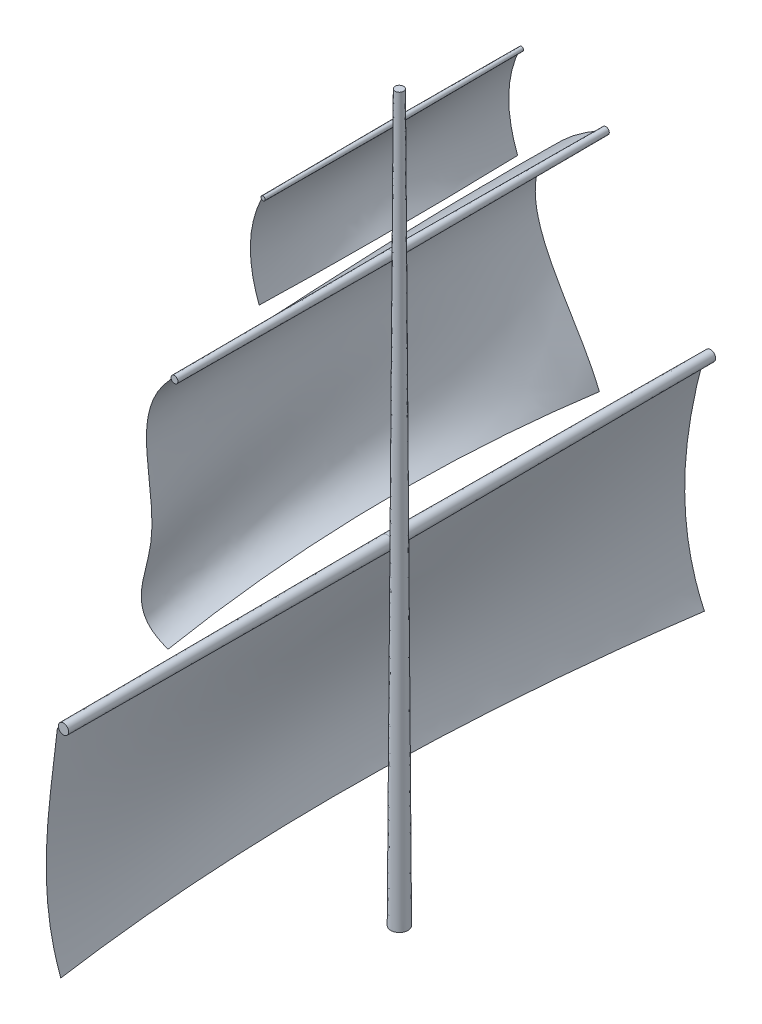
ISO-10303-21;
HEADER;
FILE_DESCRIPTION(('STEP AP214'),'2;1');
FILE_NAME('part.step','',(''),(''),'','','');
FILE_SCHEMA(('AUTOMOTIVE_DESIGN { 1 0 10303 214 1 1 1 1 }'));
ENDSEC;
DATA;
#1=APPLICATION_CONTEXT('core data for automotive mechanical design processes');
#2=APPLICATION_PROTOCOL_DEFINITION('international standard','automotive_design',2000,#1);
#3=PRODUCT_CONTEXT('',#1,'mechanical');
#4=PRODUCT('Part','Part','',(#3));
#5=PRODUCT_RELATED_PRODUCT_CATEGORY('part','',(#4));
#6=PRODUCT_DEFINITION_FORMATION('','',#4);
#7=PRODUCT_DEFINITION_CONTEXT('part definition',#1,'design');
#8=PRODUCT_DEFINITION('design','',#6,#7);
#9=PRODUCT_DEFINITION_SHAPE('','',#8);
#10=(LENGTH_UNIT() NAMED_UNIT(*) SI_UNIT(.MILLI.,.METRE.));
#11=(NAMED_UNIT(*) PLANE_ANGLE_UNIT() SI_UNIT($,.RADIAN.));
#12=(NAMED_UNIT(*) SI_UNIT($,.STERADIAN.) SOLID_ANGLE_UNIT());
#13=UNCERTAINTY_MEASURE_WITH_UNIT(LENGTH_MEASURE(1.E-05),#10,'distance_accuracy_value','');
#14=(GEOMETRIC_REPRESENTATION_CONTEXT(3) GLOBAL_UNCERTAINTY_ASSIGNED_CONTEXT((#13)) GLOBAL_UNIT_ASSIGNED_CONTEXT((#10,
#11,#12)) REPRESENTATION_CONTEXT('',''));
#15=CARTESIAN_POINT('',(0.,0.,0.));
#16=DIRECTION('',(0.,0.,1.));
#17=DIRECTION('',(1.,0.,0.));
#18=AXIS2_PLACEMENT_3D('',#15,#16,#17);
#19=CARTESIAN_POINT('',(-100.960602802566,-44.9650226884525,1214.1834459946));
#20=CARTESIAN_POINT('',(-100.960602802566,-44.9650226884525,1089.1834459946));
#21=CARTESIAN_POINT('',(-100.960602802566,-44.9650226884529,839.369528425784));
#22=CARTESIAN_POINT('',(-100.960602802566,-44.9650226884516,589.183445994602));
#23=CARTESIAN_POINT('',(-100.960602802566,-44.9650226884511,464.183445994602));
#24=CARTESIAN_POINT('',(-109.818708539546,-126.378421116059,1214.1834459946));
#25=CARTESIAN_POINT('',(-116.878199377664,-127.812599734107,1089.2068299228));
#26=CARTESIAN_POINT('',(-110.29437860858,-127.780754624803,839.346144491107));
#27=CARTESIAN_POINT('',(-129.700198564621,-127.415817484656,589.2068299228));
#28=CARTESIAN_POINT('',(-123.075534184451,-126.955578564677,464.183445994602));
#29=CARTESIAN_POINT('',(-126.989052154718,-214.219482091574,1214.1834459946));
#30=CARTESIAN_POINT('',(-141.108033830954,-217.08783932767,1089.230213851));
#31=CARTESIAN_POINT('',(-209.289887077103,-215.51618791211,839.32276055643));
#32=CARTESIAN_POINT('',(-152.069801804443,-222.987580643601,589.230213850999));
#33=CARTESIAN_POINT('',(-138.820473044104,-222.067102803643,464.183445994601));
#34=CARTESIAN_POINT('',(-97.0471646810293,-293.866747425482,1214.1834459946));
#35=CARTESIAN_POINT('',(-118.225637195383,-298.169283279626,1089.2535977792));
#36=CARTESIAN_POINT('',(-140.05647941573,-303.93301392788,839.299376621753));
#37=CARTESIAN_POINT('',(-120.834595943074,-304.012921468039,589.253597779197));
#38=CARTESIAN_POINT('',(-100.960602802566,-302.632204708102,464.183445994601));
#39=B_SPLINE_SURFACE_WITH_KNOTS('',3,3,((#19,#20,#21,#22,#23),(#24,#25,#26,#27,#28),(#29,#30,
#31,#32,#33),(#34,#35,#36,#37,#38)),.UNSPECIFIED.,.F.,.F.,.F.,(4,4),(4,1,4),(0.,1.),(0.,
0.500186082405409,1.),.UNSPECIFIED.);
#40=CARTESIAN_POINT('',(-100.960602802566,-44.9650226884525,1214.1834459946));
#41=CARTESIAN_POINT('',(-109.818708539546,-126.378421116059,1214.1834459946));
#42=CARTESIAN_POINT('',(-126.989052154718,-214.219482091574,1214.1834459946));
#43=CARTESIAN_POINT('',(-97.0471646810293,-293.866747425482,1214.1834459946));
#44=B_SPLINE_CURVE_WITH_KNOTS('',3,(#40,#41,#42,#43),.UNSPECIFIED.,.F.,.F.,(4,4),(0.,1.),.UNSPECIFIED.);
#45=CARTESIAN_POINT('',(-100.960602802566,-44.9650226884525,1214.1834459946));
#46=VERTEX_POINT('',#45);
#47=CARTESIAN_POINT('',(-97.0471646810293,-293.866747425482,1214.1834459946));
#48=VERTEX_POINT('',#47);
#49=EDGE_CURVE('P0_E13',#46,#48,#44,.T.);
#50=CARTESIAN_POINT('',(-97.0471646810293,-293.866747425482,1214.1834459946));
#51=CARTESIAN_POINT('',(-118.225637195383,-298.169283279626,1089.2535977792));
#52=CARTESIAN_POINT('',(-140.05647941573,-303.93301392788,839.299376621753));
#53=CARTESIAN_POINT('',(-120.834595943074,-304.012921468039,589.253597779197));
#54=CARTESIAN_POINT('',(-100.960602802566,-302.632204708102,464.183445994601));
#55=B_SPLINE_CURVE_WITH_KNOTS('',3,(#50,#51,#52,#53,#54),.UNSPECIFIED.,.F.,.F.,(4,1,4),(0.,
0.500186082405409,1.),.UNSPECIFIED.);
#56=CARTESIAN_POINT('',(-100.960602802566,-302.632204708102,464.183445994601));
#57=VERTEX_POINT('',#56);
#58=EDGE_CURVE('P0_E112',#48,#57,#55,.T.);
#59=CARTESIAN_POINT('',(-100.960602802566,-44.9650226884511,464.183445994602));
#60=CARTESIAN_POINT('',(-123.075534184451,-126.955578564677,464.183445994602));
#61=CARTESIAN_POINT('',(-138.820473044104,-222.067102803643,464.183445994601));
#62=CARTESIAN_POINT('',(-100.960602802566,-302.632204708102,464.183445994601));
#63=B_SPLINE_CURVE_WITH_KNOTS('',3,(#59,#60,#61,#62),.UNSPECIFIED.,.F.,.F.,(4,4),(0.,1.),.UNSPECIFIED.);
#64=CARTESIAN_POINT('',(-100.960602802566,-44.9650226884511,464.183445994602));
#65=VERTEX_POINT('',#64);
#66=EDGE_CURVE('P0_E120',#57,#65,#63,.F.);
#67=DIRECTION('',(0.,0.,1.));
#68=VECTOR('',#67,1.);
#69=CARTESIAN_POINT('',(-100.960602802566,-44.9650226884525,839.323007798665));
#70=LINE('',#69,#68);
#71=EDGE_CURVE('P0_E106',#65,#46,#70,.T.);
#72=ORIENTED_EDGE('',*,*,#49,.T.);
#73=ORIENTED_EDGE('',*,*,#58,.T.);
#74=ORIENTED_EDGE('',*,*,#66,.T.);
#75=ORIENTED_EDGE('',*,*,#71,.T.);
#76=EDGE_LOOP('',(#72,#73,#74,#75));
#77=FACE_BOUND('',#76,.T.);
#78=ADVANCED_FACE('P0_F103',(#77),#39,.T.);
#79=OPEN_SHELL('',(#78));
#80=SHELL_BASED_SURFACE_MODEL('P0_B2',(#79));
#81=CARTESIAN_POINT('',(-94.2592308843693,246.136219794413,1089.67824284904));
#82=CARTESIAN_POINT('',(-94.2592308843693,246.136219794413,1006.34490951571));
#83=CARTESIAN_POINT('',(-94.2592308843694,246.136219794413,840.415173330992));
#84=CARTESIAN_POINT('',(-94.2592308843694,246.136219794414,673.011576182373));
#85=CARTESIAN_POINT('',(-94.2592308843694,246.136219794414,589.67824284904));
#86=CARTESIAN_POINT('',(-99.4432558730941,240.630433576954,1089.67824284904));
#87=CARTESIAN_POINT('',(-100.460806724685,241.482076584033,1006.34766321308));
#88=CARTESIAN_POINT('',(-102.305691989201,242.560010972952,840.412419606703));
#89=CARTESIAN_POINT('',(-103.353521448802,241.577086684111,673.014329879745));
#90=CARTESIAN_POINT('',(-103.743817460077,240.779227817537,589.67824284904));
#91=CARTESIAN_POINT('',(-108.016857585715,229.557304149269,1089.67824284904));
#92=CARTESIAN_POINT('',(-111.069510140489,232.112233170505,1006.35317060782));
#93=CARTESIAN_POINT('',(-116.155235373363,234.654487738313,840.406912158121));
#94=CARTESIAN_POINT('',(-119.48084572357,232.44076628956,673.019837274488));
#95=CARTESIAN_POINT('',(-120.651733757393,230.047189689837,589.67824284904));
#96=CARTESIAN_POINT('',(-116.314071684048,212.749587703104,1089.67824284904));
#97=CARTESIAN_POINT('',(-121.892750687565,217.057438755459,1006.38553623403));
#98=CARTESIAN_POINT('',(-131.457696569391,221.57993141055,840.374546215536));
#99=CARTESIAN_POINT('',(-137.90428609835,217.820927718543,673.052202900697));
#100=CARTESIAN_POINT('',(-140.326585759316,213.895601995077,589.678242849039));
#101=CARTESIAN_POINT('',(-120.868420567079,195.729944569601,1089.67824284904));
#102=CARTESIAN_POINT('',(-128.643976998418,201.298598287453,1006.42498777885));
#103=CARTESIAN_POINT('',(-142.038282692813,207.185393194442,840.335094285068));
#104=CARTESIAN_POINT('',(-151.271616666264,202.606185285787,673.091654445518));
#105=CARTESIAN_POINT('',(-154.811163435431,197.691115815728,589.678242849039));
#106=CARTESIAN_POINT('',(-122.500046909039,178.485321712014,1089.67824284904));
#107=CARTESIAN_POINT('',(-132.147382085662,184.834308336752,1006.47110800002));
#108=CARTESIAN_POINT('',(-148.781919554989,191.67441543534,840.288973613064));
#109=CARTESIAN_POINT('',(-160.215723699234,186.800298536918,673.137774666691));
#110=CARTESIAN_POINT('',(-164.602214903979,181.434363170413,589.678242849039));
#111=CARTESIAN_POINT('',(-122.029243574411,161.001364996564,1089.67824284904));
#112=CARTESIAN_POINT('',(-133.279836887062,167.74221366983,1006.52315888799));
#113=CARTESIAN_POINT('',(-152.538006675372,175.168224335434,840.236922216292));
#114=CARTESIAN_POINT('',(-165.391270469528,170.491964644774,673.189825554656));
#115=CARTESIAN_POINT('',(-170.196488283203,165.125976077756,589.678242849039));
#116=CARTESIAN_POINT('',(-120.568407194918,146.221654223962,1089.67824284904));
#117=CARTESIAN_POINT('',(-132.966111971024,153.023450290094,1006.57246450768));
#118=CARTESIAN_POINT('',(-153.892592792905,160.703237373988,840.187616114636));
#119=CARTESIAN_POINT('',(-167.103864616591,156.537780519359,673.239131174347));
#120=CARTESIAN_POINT('',(-171.775024456656,151.493151476609,589.67824284904));
#121=CARTESIAN_POINT('',(-119.168709926541,134.264268266906,1089.67824284904));
#122=CARTESIAN_POINT('',(-132.394867601781,140.993853986722,1006.61514290797));
#123=CARTESIAN_POINT('',(-154.339974627506,148.773906091649,840.144937297152));
#124=CARTESIAN_POINT('',(-167.23986782683,145.192146442215,673.281809574639));
#125=CARTESIAN_POINT('',(-171.436212469,140.561706590642,589.678242849041));
#126=CARTESIAN_POINT('',(-118.10601122159,125.228447740406,1089.67824284904));
#127=CARTESIAN_POINT('',(-131.91420960961,131.852349366949,1006.64822580356));
#128=CARTESIAN_POINT('',(-154.463460252772,139.665715251429,840.111854078175));
#129=CARTESIAN_POINT('',(-166.805786875637,136.600457026438,673.314892470228));
#130=CARTESIAN_POINT('',(-170.443376529828,132.350609325971,589.678242849041));
#131=CARTESIAN_POINT('',(-117.132816587394,116.122421851403,1089.67824284904));
#132=CARTESIAN_POINT('',(-131.489294488868,122.598941020707,1006.6815015364));
#133=CARTESIAN_POINT('',(-154.480901329066,130.413901808985,840.078578020055));
#134=CARTESIAN_POINT('',(-165.916688096394,127.935378112604,673.348168203074));
#135=CARTESIAN_POINT('',(-168.773907157007,124.127077463431,589.678242849041));
#136=CARTESIAN_POINT('',(-116.35180285112,106.945082261747,1089.67824284904));
#137=CARTESIAN_POINT('',(-131.229595377805,113.241414099096,1006.71359832571));
#138=CARTESIAN_POINT('',(-154.500905137953,121.035332135027,840.046480917006));
#139=CARTESIAN_POINT('',(-164.654992082262,119.205485923541,673.380264992371));
#140=CARTESIAN_POINT('',(-166.489897865317,115.89119000535,589.678242849041));
#141=CARTESIAN_POINT('',(-115.865261103744,97.6940818931737,1089.67824284904));
#142=CARTESIAN_POINT('',(-131.244453074562,103.78696666382,1006.74246772572));
#143=CARTESIAN_POINT('',(-154.632084062192,111.547044641089,840.017611234783));
#144=CARTESIAN_POINT('',(-163.103240444003,110.419596039025,673.409134392391));
#145=CARTESIAN_POINT('',(-163.653442169539,107.643025954056,589.678242849041));
#146=CARTESIAN_POINT('',(-115.776116094754,88.3687242192055,1089.67824284904));
#147=CARTESIAN_POINT('',(-131.64026661584,94.2442826910775,1006.76511073727));
#148=CARTESIAN_POINT('',(-154.976349304561,101.967011449233,839.994968001893));
#149=CARTESIAN_POINT('',(-161.340611611671,101.586909419014,673.431777403939));
#150=CARTESIAN_POINT('',(-160.326633584454,99.3826643118772,589.678242849041));
#151=CARTESIAN_POINT('',(-116.117840030714,80.5327586230831,1089.67824284904));
#152=CARTESIAN_POINT('',(-132.375769763019,86.2246495128788,1006.7753456781));
#153=CARTESIAN_POINT('',(-155.525896526824,93.9225087053926,839.984732961015));
#154=CARTESIAN_POINT('',(-159.762149930313,94.1954309555479,673.442012344774));
#155=CARTESIAN_POINT('',(-157.197410284776,92.4889307862638,589.67824284904));
#156=CARTESIAN_POINT('',(-116.693016382633,74.2257317503018,1089.67824284904));
#157=CARTESIAN_POINT('',(-133.178615713837,79.789135184857,1006.77298844814));
#158=CARTESIAN_POINT('',(-156.008625398086,87.4902078910868,839.987090214024));
#159=CARTESIAN_POINT('',(-158.390570605393,88.2839301322095,673.439655114806));
#160=CARTESIAN_POINT('',(-154.51094871516,86.9679241726584,589.67824284904));
#161=CARTESIAN_POINT('',(-117.286210892646,69.4752860989767,1089.67824284904));
#162=CARTESIAN_POINT('',(-133.879574110222,74.9571500875305,1006.76496695241));
#163=CARTESIAN_POINT('',(-156.364036865798,82.6778275093227,839.995111788169));
#164=CARTESIAN_POINT('',(-157.2969820113,83.8564054856885,673.431633619074));
#165=CARTESIAN_POINT('',(-152.412322762358,82.8241691911879,589.67824284904));
#166=CARTESIAN_POINT('',(-118.060084952558,64.7043658457696,1089.67824284904));
#167=CARTESIAN_POINT('',(-134.674913361117,70.1247494261289,1006.74970700575));
#168=CARTESIAN_POINT('',(-156.683340582478,77.8873584994544,840.010371883989));
#169=CARTESIAN_POINT('',(-156.12664258667,79.4401215589271,673.416373672421));
#170=CARTESIAN_POINT('',(-150.237678723315,78.6774240637421,589.67824284904));
#171=CARTESIAN_POINT('',(-118.999762506794,59.9177174882254,1089.67824284904));
#172=CARTESIAN_POINT('',(-135.543521900805,65.2993076611092,1006.72723007951));
#173=CARTESIAN_POINT('',(-156.943450046424,73.1279233109976,840.032849029946));
#174=CARTESIAN_POINT('',(-154.873532253068,75.0392951594167,673.393896746176));
#175=CARTESIAN_POINT('',(-147.994778287378,74.5276986656119,589.67824284904));
#176=CARTESIAN_POINT('',(-120.056997178744,55.1292478950686,1089.67824284904));
#177=CARTESIAN_POINT('',(-136.447519895812,60.4927595676448,1006.69841755452));
#178=CARTESIAN_POINT('',(-157.126873640863,68.4071512484949,840.061661836578));
#179=CARTESIAN_POINT('',(-153.537111166703,70.656596044642,673.36508422119));
#180=CARTESIAN_POINT('',(-145.691383143894,70.3750028720882,589.678242849039));
#181=CARTESIAN_POINT('',(-121.573431434836,48.7539811562348,1089.67824284904));
#182=CARTESIAN_POINT('',(-137.656762201843,54.1217414410232,1006.65270932916));
#183=CARTESIAN_POINT('',(-157.243452750531,62.1756410021165,840.107370508741));
#184=CARTESIAN_POINT('',(-151.641057199407,64.8418401207259,673.319375995829));
#185=CARTESIAN_POINT('',(-142.549878928317,64.8341277872535,589.678242849039));
#186=CARTESIAN_POINT('',(-123.561977739745,40.8365624974571,1089.67824284904));
#187=CARTESIAN_POINT('',(-139.087724722498,46.2581423840188,1006.58456156853));
#188=CARTESIAN_POINT('',(-157.103162467051,54.5233372084341,840.175518935534));
#189=CARTESIAN_POINT('',(-149.053479966005,57.6341981390354,673.251228235192));
#190=CARTESIAN_POINT('',(-138.510570336716,57.9006573191813,589.678242849038));
#191=CARTESIAN_POINT('',(-125.77149864226,31.5027477473081,1089.67824284904));
#192=CARTESIAN_POINT('',(-140.402980885306,37.0640132080713,1006.49495210481));
#193=CARTESIAN_POINT('',(-156.324475270433,45.626069891304,840.2651292752));
#194=CARTESIAN_POINT('',(-145.585622592623,49.1080547320605,673.161618771475));
#195=CARTESIAN_POINT('',(-133.545608226169,49.5687691805768,589.678242849038));
#196=CARTESIAN_POINT('',(-127.474549445711,22.4291678535683,1089.67824284904));
#197=CARTESIAN_POINT('',(-141.041920657599,28.1981224503914,1006.40830860957));
#198=CARTESIAN_POINT('',(-154.782306337241,37.0793812697476,840.351773617394));
#199=CARTESIAN_POINT('',(-141.74255146261,40.7287333784935,673.074975276232));
#200=CARTESIAN_POINT('',(-128.524947829777,41.2252364673822,589.678242849038));
#201=CARTESIAN_POINT('',(-128.34324226284,13.7052703368971,1089.67824284904));
#202=CARTESIAN_POINT('',(-140.733164485635,19.7445486412804,1006.33501341787));
#203=CARTESIAN_POINT('',(-152.324216686975,28.948335929306,840.425069525558));
#204=CARTESIAN_POINT('',(-137.510095238046,32.5215058939178,673.001680084538));
#205=CARTESIAN_POINT('',(-123.510682662319,32.8701381819253,589.678242849038));
#206=CARTESIAN_POINT('',(-128.048602798109,5.42145682236704,1089.67824284904));
#207=CARTESIAN_POINT('',(-139.202400748935,11.7875490002441,1006.28438506572));
#208=CARTESIAN_POINT('',(-148.793732681069,21.299973963213,840.475698372606));
#209=CARTESIAN_POINT('',(-132.88502254925,24.5075333936547,672.951051732391));
#210=CARTESIAN_POINT('',(-118.564906238577,24.503553326534,589.678242849038));
#211=CARTESIAN_POINT('',(-125.66742413551,-4.91549013041006,1089.67824284904));
#212=CARTESIAN_POINT('',(-135.181871451648,1.9549043612118,1006.25370930337));
#213=CARTESIAN_POINT('',(-142.464791106606,11.8241908027229,840.506374434827));
#214=CARTESIAN_POINT('',(-126.139682409777,14.1279992683225,672.920375970032));
#215=CARTESIAN_POINT('',(-112.14464735158,13.3328967625368,589.678242849039));
#216=CARTESIAN_POINT('',(-118.139992055009,-16.2850355017236,1089.67824284904));
#217=CARTESIAN_POINT('',(-125.680981269432,-8.6766228048706,1006.30157742977));
#218=CARTESIAN_POINT('',(-131.02965265586,1.55489436801979,840.458505840498));
#219=CARTESIAN_POINT('',(-116.872605156682,1.68043753302988,672.968244096439));
#220=CARTESIAN_POINT('',(-104.601013176024,-0.658745355656522,589.678242849039));
#221=CARTESIAN_POINT('',(-105.513089953227,-23.2417882405583,1089.67824284904));
#222=CARTESIAN_POINT('',(-112.119693900286,-14.9273691549548,1006.37179729644));
#223=CARTESIAN_POINT('',(-117.62922062408,-4.8284371342996,840.38828528742));
#224=CARTESIAN_POINT('',(-107.594544845613,-7.22705191443058,673.038463963111));
#225=CARTESIAN_POINT('',(-99.4110733098088,-11.8818472118726,589.678242849039));
#226=CARTESIAN_POINT('',(-97.1101365982992,-26.0652021784355,1089.67824284904));
#227=CARTESIAN_POINT('',(-103.249547911676,-17.3977798984568,1006.40690722978));
#228=CARTESIAN_POINT('',(-109.388989231886,-7.3123487919164,840.353175010879));
#229=CARTESIAN_POINT('',(-103.249547911676,-11.688138342139,673.073573896447));
#230=CARTESIAN_POINT('',(-97.1101365982992,-17.5007398439589,589.678242849039));
#231=B_SPLINE_SURFACE_WITH_KNOTS('',3,3,((#81,#82,#83,#84,#85),(#86,#87,#88,#89,#90),(#91,#92,
#93,#94,#95),(#96,#97,#98,#99,#100),(#101,#102,#103,#104,#105),(#106,#107,#108,#109,#110),(#111,
#112,#113,#114,#115),(#116,#117,#118,#119,#120),(#121,#122,#123,#124,#125),(#126,#127,#128,#129,
#130),(#131,#132,#133,#134,#135),(#136,#137,#138,#139,#140),(#141,#142,#143,#144,#145),(#146,
#147,#148,#149,#150),(#151,#152,#153,#154,#155),(#156,#157,#158,#159,#160),(#161,#162,#163,#164,
#165),(#166,#167,#168,#169,#170),(#171,#172,#173,#174,#175),(#176,#177,#178,#179,#180),(#181,
#182,#183,#184,#185),(#186,#187,#188,#189,#190),(#191,#192,#193,#194,#195),(#196,#197,#198,#199,
#200),(#201,#202,#203,#204,#205),(#206,#207,#208,#209,#210),(#211,#212,#213,#214,#215),(#216,
#217,#218,#219,#220),(#221,#222,#223,#224,#225),(#226,#227,#228,#229,#230)),.UNSPECIFIED.,.F.,
.F.,.F.,(4,1,1,1,1,1,1,1,1,1,1,1,1,1,1,1,1,1,1,1,1,1,1,1,1,1,1,4),(4,1,4),(0.,0.0625,0.125,
0.1875,0.25,0.3125,0.375,0.40625,0.4375,0.46875,0.5,0.53125,0.5625,0.59375,0.609375,0.625,
0.640625,0.65625,0.671875,0.6875,0.71875,0.75,0.78125,0.8125,0.84375,0.875,0.9375,1.),(0.,
0.50110539032025,1.),.UNSPECIFIED.);
#232=CARTESIAN_POINT('',(-94.2592308843693,246.136219794413,1089.67824284904));
#233=CARTESIAN_POINT('',(-99.4432558730941,240.630433576954,1089.67824284904));
#234=CARTESIAN_POINT('',(-108.016857585715,229.557304149269,1089.67824284904));
#235=CARTESIAN_POINT('',(-116.314071684048,212.749587703104,1089.67824284904));
#236=CARTESIAN_POINT('',(-120.868420567079,195.729944569601,1089.67824284904));
#237=CARTESIAN_POINT('',(-122.500046909039,178.485321712014,1089.67824284904));
#238=CARTESIAN_POINT('',(-122.029243574411,161.001364996564,1089.67824284904));
#239=CARTESIAN_POINT('',(-120.568407194918,146.221654223962,1089.67824284904));
#240=CARTESIAN_POINT('',(-119.168709926541,134.264268266906,1089.67824284904));
#241=CARTESIAN_POINT('',(-118.10601122159,125.228447740406,1089.67824284904));
#242=CARTESIAN_POINT('',(-117.132816587394,116.122421851403,1089.67824284904));
#243=CARTESIAN_POINT('',(-116.35180285112,106.945082261747,1089.67824284904));
#244=CARTESIAN_POINT('',(-115.865261103744,97.6940818931737,1089.67824284904));
#245=CARTESIAN_POINT('',(-115.776116094754,88.3687242192055,1089.67824284904));
#246=CARTESIAN_POINT('',(-116.117840030714,80.5327586230831,1089.67824284904));
#247=CARTESIAN_POINT('',(-116.693016382633,74.2257317503018,1089.67824284904));
#248=CARTESIAN_POINT('',(-117.286210892646,69.4752860989767,1089.67824284904));
#249=CARTESIAN_POINT('',(-118.060084952558,64.7043658457696,1089.67824284904));
#250=CARTESIAN_POINT('',(-118.999762506794,59.9177174882254,1089.67824284904));
#251=CARTESIAN_POINT('',(-120.056997178744,55.1292478950686,1089.67824284904));
#252=CARTESIAN_POINT('',(-121.573431434836,48.7539811562348,1089.67824284904));
#253=CARTESIAN_POINT('',(-123.561977739745,40.8365624974571,1089.67824284904));
#254=CARTESIAN_POINT('',(-125.77149864226,31.5027477473081,1089.67824284904));
#255=CARTESIAN_POINT('',(-127.474549445711,22.4291678535683,1089.67824284904));
#256=CARTESIAN_POINT('',(-128.34324226284,13.7052703368971,1089.67824284904));
#257=CARTESIAN_POINT('',(-128.048602798109,5.42145682236704,1089.67824284904));
#258=CARTESIAN_POINT('',(-125.66742413551,-4.91549013041006,1089.67824284904));
#259=CARTESIAN_POINT('',(-118.139992055009,-16.2850355017236,1089.67824284904));
#260=CARTESIAN_POINT('',(-105.513089953227,-23.2417882405583,1089.67824284904));
#261=CARTESIAN_POINT('',(-97.1101365982992,-26.0652021784355,1089.67824284904));
#262=B_SPLINE_CURVE_WITH_KNOTS('',3,(#232,#233,#234,#235,#236,#237,#238,#239,#240,#241,#242,
#243,#244,#245,#246,#247,#248,#249,#250,#251,#252,#253,#254,#255,#256,#257,#258,#259,#260,#261),
.UNSPECIFIED.,.F.,.F.,(4,1,1,1,1,1,1,1,1,1,1,1,1,1,1,1,1,1,1,1,1,1,1,1,1,1,1,4),(0.,0.0625,
0.125,0.1875,0.25,0.3125,0.375,0.40625,0.4375,0.46875,0.5,0.53125,0.5625,0.59375,0.609375,0.625,
0.640625,0.65625,0.671875,0.6875,0.71875,0.75,0.78125,0.8125,0.84375,0.875,0.9375,1.),.UNSPECIFIED.);
#263=CARTESIAN_POINT('',(-94.2592308843693,246.136219794413,1089.67824284904));
#264=VERTEX_POINT('',#263);
#265=CARTESIAN_POINT('',(-97.1101365982992,-26.0652021784355,1089.67824284904));
#266=VERTEX_POINT('',#265);
#267=EDGE_CURVE('P0_E101',#264,#266,#262,.T.);
#268=CARTESIAN_POINT('',(-97.1101365982992,-26.0652021784355,1089.67824284904));
#269=CARTESIAN_POINT('',(-103.249547911676,-17.3977798984568,1006.40690722978));
#270=CARTESIAN_POINT('',(-109.388989231886,-7.3123487919164,840.353175010879));
#271=CARTESIAN_POINT('',(-103.249547911676,-11.688138342139,673.073573896447));
#272=CARTESIAN_POINT('',(-97.1101365982992,-17.5007398439589,589.678242849039));
#273=B_SPLINE_CURVE_WITH_KNOTS('',3,(#268,#269,#270,#271,#272),.UNSPECIFIED.,.F.,.F.,(4,1,4),
(0.,0.50110539032025,1.),.UNSPECIFIED.);
#274=CARTESIAN_POINT('',(-97.1101365982992,-17.5007398439589,589.678242849039));
#275=VERTEX_POINT('',#274);
#276=EDGE_CURVE('P0_E186',#266,#275,#273,.T.);
#277=CARTESIAN_POINT('',(-94.2592308843694,246.136219794414,589.67824284904));
#278=CARTESIAN_POINT('',(-103.743817460077,240.779227817537,589.67824284904));
#279=CARTESIAN_POINT('',(-120.651733757393,230.047189689837,589.67824284904));
#280=CARTESIAN_POINT('',(-140.326585759316,213.895601995077,589.678242849039));
#281=CARTESIAN_POINT('',(-154.811163435431,197.691115815728,589.678242849039));
#282=CARTESIAN_POINT('',(-164.602214903979,181.434363170413,589.678242849039));
#283=CARTESIAN_POINT('',(-170.196488283203,165.125976077756,589.678242849039));
#284=CARTESIAN_POINT('',(-171.775024456656,151.493151476609,589.67824284904));
#285=CARTESIAN_POINT('',(-171.436212469,140.561706590642,589.678242849041));
#286=CARTESIAN_POINT('',(-170.443376529828,132.350609325971,589.678242849041));
#287=CARTESIAN_POINT('',(-168.773907157007,124.127077463431,589.678242849041));
#288=CARTESIAN_POINT('',(-166.489897865317,115.89119000535,589.678242849041));
#289=CARTESIAN_POINT('',(-163.653442169539,107.643025954056,589.678242849041));
#290=CARTESIAN_POINT('',(-160.326633584454,99.3826643118772,589.678242849041));
#291=CARTESIAN_POINT('',(-157.197410284776,92.4889307862638,589.67824284904));
#292=CARTESIAN_POINT('',(-154.51094871516,86.9679241726584,589.67824284904));
#293=CARTESIAN_POINT('',(-152.412322762358,82.8241691911879,589.67824284904));
#294=CARTESIAN_POINT('',(-150.237678723315,78.6774240637421,589.67824284904));
#295=CARTESIAN_POINT('',(-147.994778287378,74.5276986656119,589.67824284904));
#296=CARTESIAN_POINT('',(-145.691383143894,70.3750028720882,589.678242849039));
#297=CARTESIAN_POINT('',(-142.549878928317,64.8341277872535,589.678242849039));
#298=CARTESIAN_POINT('',(-138.510570336716,57.9006573191813,589.678242849038));
#299=CARTESIAN_POINT('',(-133.545608226169,49.5687691805768,589.678242849038));
#300=CARTESIAN_POINT('',(-128.524947829777,41.2252364673822,589.678242849038));
#301=CARTESIAN_POINT('',(-123.510682662319,32.8701381819253,589.678242849038));
#302=CARTESIAN_POINT('',(-118.564906238577,24.503553326534,589.678242849038));
#303=CARTESIAN_POINT('',(-112.14464735158,13.3328967625368,589.678242849039));
#304=CARTESIAN_POINT('',(-104.601013176024,-0.658745355656522,589.678242849039));
#305=CARTESIAN_POINT('',(-99.4110733098088,-11.8818472118726,589.678242849039));
#306=CARTESIAN_POINT('',(-97.1101365982992,-17.5007398439589,589.678242849039));
#307=B_SPLINE_CURVE_WITH_KNOTS('',3,(#277,#278,#279,#280,#281,#282,#283,#284,#285,#286,#287,
#288,#289,#290,#291,#292,#293,#294,#295,#296,#297,#298,#299,#300,#301,#302,#303,#304,#305,#306),
.UNSPECIFIED.,.F.,.F.,(4,1,1,1,1,1,1,1,1,1,1,1,1,1,1,1,1,1,1,1,1,1,1,1,1,1,1,4),(0.,0.0625,
0.125,0.1875,0.25,0.3125,0.375,0.40625,0.4375,0.46875,0.5,0.53125,0.5625,0.59375,0.609375,0.625,
0.640625,0.65625,0.671875,0.6875,0.71875,0.75,0.78125,0.8125,0.84375,0.875,0.9375,1.),.UNSPECIFIED.);
#308=CARTESIAN_POINT('',(-94.2592308843694,246.136219794414,589.67824284904));
#309=VERTEX_POINT('',#308);
#310=EDGE_CURVE('P0_E194',#275,#309,#307,.F.);
#311=DIRECTION('',(0.,0.,1.));
#312=VECTOR('',#311,1.);
#313=CARTESIAN_POINT('',(-94.2592308843694,246.136219794413,840.230938015124));
#314=LINE('',#313,#312);
#315=EDGE_CURVE('P0_E180',#309,#264,#314,.T.);
#316=ORIENTED_EDGE('',*,*,#267,.T.);
#317=ORIENTED_EDGE('',*,*,#276,.T.);
#318=ORIENTED_EDGE('',*,*,#310,.T.);
#319=ORIENTED_EDGE('',*,*,#315,.T.);
#320=EDGE_LOOP('',(#316,#317,#318,#319));
#321=FACE_BOUND('',#320,.T.);
#322=ADVANCED_FACE('P0_F177',(#321),#231,.T.);
#323=OPEN_SHELL('',(#322));
#324=SHELL_BASED_SURFACE_MODEL('P0_B7',(#323));
#325=CARTESIAN_POINT('',(-88.6207885054812,381.301112103505,690.028127364348));
#326=CARTESIAN_POINT('',(-88.4661256894326,381.441212813192,740.019213064073));
#327=CARTESIAN_POINT('',(-88.3113337146247,381.425289258014,840.030985121707));
#328=CARTESIAN_POINT('',(-88.4656093067195,380.817373333153,940.019355703827));
#329=CARTESIAN_POINT('',(-88.6200139314115,380.365352883446,990.028341323979));
#330=CARTESIAN_POINT('',(-105.296835093531,346.700139827139,690.048467577437));
#331=CARTESIAN_POINT('',(-105.381794499681,346.129795040756,740.040907821578));
#332=CARTESIAN_POINT('',(-135.998215602577,331.023183241564,840.009592941615));
#333=CARTESIAN_POINT('',(-104.97699572742,345.635124143741,940.040444996736));
#334=CARTESIAN_POINT('',(-104.840257283663,345.992245332057,990.04801193234));
#335=CARTESIAN_POINT('',(-106.302645505554,310.426194971925,690.044282133223));
#336=CARTESIAN_POINT('',(-106.627227133901,309.145404689471,740.03807692178));
#337=CARTESIAN_POINT('',(-137.457492595772,293.377715101489,840.012487949668));
#338=CARTESIAN_POINT('',(-106.119386669139,308.848126076362,940.037485816674));
#339=CARTESIAN_POINT('',(-105.691505156934,310.014388902701,990.043634067731));
#340=CARTESIAN_POINT('',(-91.6382197415496,272.479277537861,690.015571031706));
#341=CARTESIAN_POINT('',(-92.2024235920946,270.488041759337,740.010720364679));
#342=CARTESIAN_POINT('',(-92.6891646942102,268.488884837788,840.039670145865));
#343=CARTESIAN_POINT('',(-91.8927821318761,270.456379131015,940.010478163643));
#344=CARTESIAN_POINT('',(-91.1737575512218,272.431783595377,990.015207730152));
#345=B_SPLINE_SURFACE_WITH_KNOTS('',3,3,((#325,#326,#327,#328,#329),(#330,#331,#332,#333,#334),
(#335,#336,#337,#338,#339),(#340,#341,#342,#343,#344)),.UNSPECIFIED.,.F.,.F.,.F.,(4,4),(4,1,4),
(0.,1.),(0.,0.499874326327336,1.),.UNSPECIFIED.);
#346=CARTESIAN_POINT('',(-88.6207885054812,381.301112103505,690.028127364348));
#347=CARTESIAN_POINT('',(-105.296835093531,346.700139827139,690.048467577437));
#348=CARTESIAN_POINT('',(-106.302645505554,310.426194971925,690.044282133223));
#349=CARTESIAN_POINT('',(-91.6382197415496,272.479277537861,690.015571031706));
#350=B_SPLINE_CURVE_WITH_KNOTS('',3,(#346,#347,#348,#349),.UNSPECIFIED.,.F.,.F.,(4,4),(0.,1.),.UNSPECIFIED.);
#351=CARTESIAN_POINT('',(-88.6207885054812,381.301112103505,690.028127364348));
#352=VERTEX_POINT('',#351);
#353=CARTESIAN_POINT('',(-91.6382197415496,272.479277537861,690.015571031706));
#354=VERTEX_POINT('',#353);
#355=EDGE_CURVE('P0_E175',#352,#354,#350,.T.);
#356=CARTESIAN_POINT('',(-91.6382197415496,272.479277537861,690.015571031706));
#357=CARTESIAN_POINT('',(-92.2024235920946,270.488041759337,740.010720364679));
#358=CARTESIAN_POINT('',(-92.6891646942102,268.488884837788,840.039670145865));
#359=CARTESIAN_POINT('',(-91.8927821318761,270.456379131015,940.010478163643));
#360=CARTESIAN_POINT('',(-91.1737575512218,272.431783595377,990.015207730152));
#361=B_SPLINE_CURVE_WITH_KNOTS('',3,(#356,#357,#358,#359,#360),.UNSPECIFIED.,.F.,.F.,(4,1,4),
(0.,0.499874326327336,1.),.UNSPECIFIED.);
#362=CARTESIAN_POINT('',(-91.1737575512218,272.431783595377,990.015207730152));
#363=VERTEX_POINT('',#362);
#364=EDGE_CURVE('P0_E253',#354,#363,#361,.T.);
#365=CARTESIAN_POINT('',(-88.6200139314115,380.365352883446,990.028341323979));
#366=CARTESIAN_POINT('',(-104.840257283663,345.992245332057,990.04801193234));
#367=CARTESIAN_POINT('',(-105.691505156934,310.014388902701,990.043634067731));
#368=CARTESIAN_POINT('',(-91.1737575512218,272.431783595377,990.015207730152));
#369=B_SPLINE_CURVE_WITH_KNOTS('',3,(#365,#366,#367,#368),.UNSPECIFIED.,.F.,.F.,(4,4),(0.,1.),.UNSPECIFIED.);
#370=CARTESIAN_POINT('',(-88.6200139314115,380.365352883446,990.028341323979));
#371=VERTEX_POINT('',#370);
#372=EDGE_CURVE('P0_E261',#363,#371,#369,.F.);
#373=CARTESIAN_POINT('',(-88.6207885054812,381.301112103505,690.028127364348));
#374=CARTESIAN_POINT('',(-88.4661256894326,381.441212813192,740.019213064073));
#375=CARTESIAN_POINT('',(-88.3113337146247,381.425289258014,840.030985121707));
#376=CARTESIAN_POINT('',(-88.4656093067195,380.817373333153,940.019355703827));
#377=CARTESIAN_POINT('',(-88.6200139314115,380.365352883446,990.028341323979));
#378=B_SPLINE_CURVE_WITH_KNOTS('',3,(#373,#374,#375,#376,#377),.UNSPECIFIED.,.F.,.F.,(4,1,4),
(0.,0.499874326327336,1.),.UNSPECIFIED.);
#379=EDGE_CURVE('P0_E245',#371,#352,#378,.F.);
#380=ORIENTED_EDGE('',*,*,#355,.T.);
#381=ORIENTED_EDGE('',*,*,#364,.T.);
#382=ORIENTED_EDGE('',*,*,#372,.T.);
#383=ORIENTED_EDGE('',*,*,#379,.T.);
#384=EDGE_LOOP('',(#380,#381,#382,#383));
#385=FACE_BOUND('',#384,.T.);
#386=ADVANCED_FACE('P0_F242',(#385),#345,.T.);
#387=OPEN_SHELL('',(#386));
#388=SHELL_BASED_SURFACE_MODEL('P0_B95',(#387));
#389=CARTESIAN_POINT('',(-89.7449178600127,248.28586579274,839.67824284904));
#390=DIRECTION('',(0.,0.,-1.));
#391=DIRECTION('',(1.,0.,0.));
#392=AXIS2_PLACEMENT_3D('',#389,#390,#391);
#393=CONICAL_SURFACE('',#392,5.,0.00399997866687154);
#394=CARTESIAN_POINT('',(-89.7449178600127,248.285865792739,1089.67824284904));
#395=DIRECTION('',(0.,0.,1.));
#396=DIRECTION('',(-1.,0.,0.));
#397=AXIS2_PLACEMENT_3D('',#394,#395,#396);
#398=CIRCLE('',#397,3.99999999999998);
#399=CARTESIAN_POINT('',(-93.7449178600127,248.285865792739,1089.67824284904));
#400=VERTEX_POINT('',#399);
#401=EDGE_CURVE('P1_E12',#400,#400,#398,.T.);
#402=ORIENTED_EDGE('',*,*,#401,.F.);
#403=EDGE_LOOP('',(#402));
#404=FACE_BOUND('',#403,.T.);
#405=CARTESIAN_POINT('',(-89.7449178600127,248.28586579274,839.67824284904));
#406=DIRECTION('',(0.,0.,1.));
#407=DIRECTION('',(-1.,0.,0.));
#408=AXIS2_PLACEMENT_3D('',#405,#406,#407);
#409=CIRCLE('',#408,5.);
#410=CARTESIAN_POINT('',(-94.7449178600127,248.28586579274,839.67824284904));
#411=VERTEX_POINT('',#410);
#412=EDGE_CURVE('P1_E28',#411,#411,#409,.T.);
#413=ORIENTED_EDGE('',*,*,#412,.T.);
#414=EDGE_LOOP('',(#413));
#415=FACE_BOUND('',#414,.T.);
#416=ADVANCED_FACE('P1_F22',(#404,#415),#393,.T.);
#417=CARTESIAN_POINT('',(-85.7449178600127,248.285865792739,1089.67824284904));
#418=DIRECTION('',(0.,0.,-1.));
#419=DIRECTION('',(1.,0.,0.));
#420=AXIS2_PLACEMENT_3D('',#417,#418,#419);
#421=PLANE('',#420);
#422=ORIENTED_EDGE('',*,*,#401,.T.);
#423=EDGE_LOOP('',(#422));
#424=FACE_BOUND('',#423,.T.);
#425=ADVANCED_FACE('P1_F49',(#424),#421,.F.);
#426=CARTESIAN_POINT('',(-89.7449178600127,248.28586579274,839.67824284904));
#427=DIRECTION('',(0.,0.,1.));
#428=DIRECTION('',(1.,0.,0.));
#429=AXIS2_PLACEMENT_3D('',#426,#427,#428);
#430=CONICAL_SURFACE('',#429,5.,0.00399997866687154);
#431=CARTESIAN_POINT('',(-89.7449178600128,248.285865792741,589.67824284904));
#432=DIRECTION('',(0.,0.,1.));
#433=DIRECTION('',(-1.,0.,0.));
#434=AXIS2_PLACEMENT_3D('',#431,#432,#433);
#435=CIRCLE('',#434,3.99999999999998);
#436=CARTESIAN_POINT('',(-93.7449178600127,248.285865792741,589.67824284904));
#437=VERTEX_POINT('',#436);
#438=EDGE_CURVE('P1_E32',#437,#437,#435,.T.);
#439=ORIENTED_EDGE('',*,*,#438,.T.);
#440=EDGE_LOOP('',(#439));
#441=FACE_BOUND('',#440,.T.);
#442=ORIENTED_EDGE('',*,*,#412,.F.);
#443=EDGE_LOOP('',(#442));
#444=FACE_BOUND('',#443,.T.);
#445=ADVANCED_FACE('P1_F39',(#441,#444),#430,.T.);
#446=CARTESIAN_POINT('',(-85.7449178600128,248.285865792741,589.67824284904));
#447=DIRECTION('',(0.,0.,1.));
#448=DIRECTION('',(1.,0.,0.));
#449=AXIS2_PLACEMENT_3D('',#446,#447,#448);
#450=PLANE('',#449);
#451=ORIENTED_EDGE('',*,*,#438,.F.);
#452=EDGE_LOOP('',(#451));
#453=FACE_BOUND('',#452,.T.);
#454=ADVANCED_FACE('P1_F42',(#453),#450,.F.);
#455=CLOSED_SHELL('',(#416,#425,#445,#454));
#456=MANIFOLD_SOLID_BREP('P1_B1',#455);
#457=CARTESIAN_POINT('',(-93.9402926971648,-42.3258474339443,839.183445994602));
#458=DIRECTION('',(0.,0.,-1.));
#459=DIRECTION('',(1.,0.,0.));
#460=AXIS2_PLACEMENT_3D('',#457,#458,#459);
#461=CONICAL_SURFACE('',#460,7.5,0.00399997866687154);
#462=CARTESIAN_POINT('',(-93.9402926971648,-42.3258474339456,1214.1834459946));
#463=DIRECTION('',(0.,0.,1.));
#464=DIRECTION('',(-1.,0.,0.));
#465=AXIS2_PLACEMENT_3D('',#462,#463,#464);
#466=CIRCLE('',#465,5.99999999999997);
#467=CARTESIAN_POINT('',(-99.9402926971647,-42.3258474339456,1214.1834459946));
#468=VERTEX_POINT('',#467);
#469=EDGE_CURVE('P2_E10',#468,#468,#466,.T.);
#470=ORIENTED_EDGE('',*,*,#469,.F.);
#471=EDGE_LOOP('',(#470));
#472=FACE_BOUND('',#471,.T.);
#473=CARTESIAN_POINT('',(-93.9402926971648,-42.3258474339443,839.183445994602));
#474=DIRECTION('',(0.,0.,1.));
#475=DIRECTION('',(-1.,0.,0.));
#476=AXIS2_PLACEMENT_3D('',#473,#474,#475);
#477=CIRCLE('',#476,7.5);
#478=CARTESIAN_POINT('',(-101.440292697165,-42.3258474339443,839.183445994602));
#479=VERTEX_POINT('',#478);
#480=EDGE_CURVE('P2_E20',#479,#479,#477,.T.);
#481=ORIENTED_EDGE('',*,*,#480,.T.);
#482=EDGE_LOOP('',(#481));
#483=FACE_BOUND('',#482,.T.);
#484=ADVANCED_FACE('P2_F14',(#472,#483),#461,.T.);
#485=CARTESIAN_POINT('',(-87.9402926971648,-42.3258474339456,1214.1834459946));
#486=DIRECTION('',(0.,0.,-1.));
#487=DIRECTION('',(1.,0.,0.));
#488=AXIS2_PLACEMENT_3D('',#485,#486,#487);
#489=PLANE('',#488);
#490=ORIENTED_EDGE('',*,*,#469,.T.);
#491=EDGE_LOOP('',(#490));
#492=FACE_BOUND('',#491,.T.);
#493=ADVANCED_FACE('P2_F41',(#492),#489,.F.);
#494=CARTESIAN_POINT('',(-93.9402926971648,-42.3258474339443,839.183445994602));
#495=DIRECTION('',(0.,0.,1.));
#496=DIRECTION('',(1.,0.,0.));
#497=AXIS2_PLACEMENT_3D('',#494,#495,#496);
#498=CONICAL_SURFACE('',#497,7.5,0.00399997866687154);
#499=CARTESIAN_POINT('',(-93.9402926971648,-42.325847433943,464.183445994602));
#500=DIRECTION('',(0.,0.,1.));
#501=DIRECTION('',(-1.,0.,0.));
#502=AXIS2_PLACEMENT_3D('',#499,#500,#501);
#503=CIRCLE('',#502,5.99999999999997);
#504=CARTESIAN_POINT('',(-99.9402926971648,-42.325847433943,464.183445994602));
#505=VERTEX_POINT('',#504);
#506=EDGE_CURVE('P2_E24',#505,#505,#503,.T.);
#507=ORIENTED_EDGE('',*,*,#506,.T.);
#508=EDGE_LOOP('',(#507));
#509=FACE_BOUND('',#508,.T.);
#510=ORIENTED_EDGE('',*,*,#480,.F.);
#511=EDGE_LOOP('',(#510));
#512=FACE_BOUND('',#511,.T.);
#513=ADVANCED_FACE('P2_F31',(#509,#512),#498,.T.);
#514=CARTESIAN_POINT('',(-87.9402926971648,-42.325847433943,464.183445994602));
#515=DIRECTION('',(0.,0.,1.));
#516=DIRECTION('',(1.,0.,0.));
#517=AXIS2_PLACEMENT_3D('',#514,#515,#516);
#518=PLANE('',#517);
#519=ORIENTED_EDGE('',*,*,#506,.F.);
#520=EDGE_LOOP('',(#519));
#521=FACE_BOUND('',#520,.T.);
#522=ADVANCED_FACE('P2_F34',(#521),#518,.F.);
#523=CLOSED_SHELL('',(#484,#493,#513,#522));
#524=MANIFOLD_SOLID_BREP('P2_B1',#523);
#525=CARTESIAN_POINT('',(-78.7260500884754,-419.11543763945,840.));
#526=DIRECTION('',(0.,1.,0.));
#527=DIRECTION('',(0.,0.,1.));
#528=AXIS2_PLACEMENT_3D('',#525,#526,#527);
#529=PLANE('',#528);
#530=CARTESIAN_POINT('',(-78.7260500884754,-419.11543763945,840.));
#531=DIRECTION('',(0.,1.,0.));
#532=DIRECTION('',(0.,0.,1.));
#533=AXIS2_PLACEMENT_3D('',#530,#531,#532);
#534=CIRCLE('',#533,10.);
#535=CARTESIAN_POINT('',(-78.7260500884754,-419.11543763945,850.));
#536=VERTEX_POINT('',#535);
#537=EDGE_CURVE('P3_E12',#536,#536,#534,.T.);
#538=ORIENTED_EDGE('',*,*,#537,.F.);
#539=EDGE_LOOP('',(#538));
#540=FACE_BOUND('',#539,.T.);
#541=ADVANCED_FACE('P3_F22',(#540),#529,.F.);
#542=CARTESIAN_POINT('',(-78.7260500884754,-419.11543763945,840.));
#543=DIRECTION('',(0.,-1.,0.));
#544=DIRECTION('',(0.,0.,-1.));
#545=AXIS2_PLACEMENT_3D('',#542,#543,#544);
#546=CONICAL_SURFACE('',#545,10.,0.00595231065459163);
#547=CARTESIAN_POINT('',(-78.7260500884754,420.88456236055,840.));
#548=DIRECTION('',(0.,1.,0.));
#549=DIRECTION('',(0.,0.,1.));
#550=AXIS2_PLACEMENT_3D('',#547,#548,#549);
#551=CIRCLE('',#550,5.);
#552=CARTESIAN_POINT('',(-78.7260500884754,420.88456236055,845.));
#553=VERTEX_POINT('',#552);
#554=EDGE_CURVE('P3_E28',#553,#553,#551,.T.);
#555=ORIENTED_EDGE('',*,*,#554,.F.);
#556=EDGE_LOOP('',(#555));
#557=FACE_BOUND('',#556,.T.);
#558=ORIENTED_EDGE('',*,*,#537,.T.);
#559=EDGE_LOOP('',(#558));
#560=FACE_BOUND('',#559,.T.);
#561=ADVANCED_FACE('P3_F36',(#557,#560),#546,.T.);
#562=CARTESIAN_POINT('',(-73.7260500884754,420.88456236055,840.));
#563=DIRECTION('',(0.,-1.,0.));
#564=DIRECTION('',(0.,0.,-1.));
#565=AXIS2_PLACEMENT_3D('',#562,#563,#564);
#566=PLANE('',#565);
#567=ORIENTED_EDGE('',*,*,#554,.T.);
#568=EDGE_LOOP('',(#567));
#569=FACE_BOUND('',#568,.T.);
#570=ADVANCED_FACE('P3_F34',(#569),#566,.F.);
#571=CLOSED_SHELL('',(#541,#561,#570));
#572=MANIFOLD_SOLID_BREP('P3_B1',#571);
#573=CARTESIAN_POINT('',(-86.9583266036021,381.863232048069,840.025824167656));
#574=DIRECTION('',(-0.00154820730109272,0.000158313141613085,-0.999998788994818));
#575=DIRECTION('',(0.962067557119707,-0.272807013212482,-0.00153267080746521));
#576=AXIS2_PLACEMENT_3D('',#573,#574,#575);
#577=CONICAL_SURFACE('',#576,3.,0.00399997866687154);
#578=CARTESIAN_POINT('',(-86.7260955084382,381.839485076827,990.025642516879));
#579=DIRECTION('',(0.00154820730109272,-0.000158313141613085,0.999998788994818));
#580=DIRECTION('',(-0.962067557119707,0.272807013212482,0.00153267080746521));
#581=AXIS2_PLACEMENT_3D('',#578,#579,#580);
#582=CIRCLE('',#581,2.39999999999999);
#583=CARTESIAN_POINT('',(-89.0350576455255,382.494221908537,990.029320926817));
#584=VERTEX_POINT('',#583);
#585=EDGE_CURVE('P4_E12',#584,#584,#582,.T.);
#586=ORIENTED_EDGE('',*,*,#585,.F.);
#587=EDGE_LOOP('',(#586));
#588=FACE_BOUND('',#587,.T.);
#589=CARTESIAN_POINT('',(-86.9583266036021,381.863232048069,840.025824167656));
#590=DIRECTION('',(0.00154820730109272,-0.000158313141613085,0.999998788994818));
#591=DIRECTION('',(-0.962067557119707,0.272807013212482,0.00153267080746521));
#592=AXIS2_PLACEMENT_3D('',#589,#590,#591);
#593=CIRCLE('',#592,3.);
#594=CARTESIAN_POINT('',(-89.8445292749612,382.681653087706,840.030422180079));
#595=VERTEX_POINT('',#594);
#596=EDGE_CURVE('P4_E28',#595,#595,#593,.T.);
#597=ORIENTED_EDGE('',*,*,#596,.T.);
#598=EDGE_LOOP('',(#597));
#599=FACE_BOUND('',#598,.T.);
#600=ADVANCED_FACE('P4_F22',(#588,#599),#577,.T.);
#601=CARTESIAN_POINT('',(-84.4171333713509,381.184748245117,990.021964106941));
#602=DIRECTION('',(-0.00154820730109272,0.000158313141613085,-0.999998788994818));
#603=DIRECTION('',(0.962067557119707,-0.272807013212482,-0.00153267080746521));
#604=AXIS2_PLACEMENT_3D('',#601,#602,#603);
#605=PLANE('',#604);
#606=ORIENTED_EDGE('',*,*,#585,.T.);
#607=EDGE_LOOP('',(#606));
#608=FACE_BOUND('',#607,.T.);
#609=ADVANCED_FACE('P4_F49',(#608),#605,.F.);
#610=CARTESIAN_POINT('',(-86.9583266036021,381.863232048069,840.025824167656));
#611=DIRECTION('',(0.00154820730109272,-0.000158313141613085,0.999998788994818));
#612=DIRECTION('',(0.962067557119707,-0.272807013212482,-0.00153267080746521));
#613=AXIS2_PLACEMENT_3D('',#610,#611,#612);
#614=CONICAL_SURFACE('',#613,3.,0.00399997866687154);
#615=CARTESIAN_POINT('',(-87.190557698766,381.886979019311,690.026005818434));
#616=DIRECTION('',(0.00154820730109272,-0.000158313141613085,0.999998788994818));
#617=DIRECTION('',(-0.962067557119707,0.272807013212482,0.00153267080746521));
#618=AXIS2_PLACEMENT_3D('',#615,#616,#617);
#619=CIRCLE('',#618,2.39999999999999);
#620=CARTESIAN_POINT('',(-89.4995198358533,382.541715851021,690.029684228372));
#621=VERTEX_POINT('',#620);
#622=EDGE_CURVE('P4_E32',#621,#621,#619,.T.);
#623=ORIENTED_EDGE('',*,*,#622,.T.);
#624=EDGE_LOOP('',(#623));
#625=FACE_BOUND('',#624,.T.);
#626=ORIENTED_EDGE('',*,*,#596,.F.);
#627=EDGE_LOOP('',(#626));
#628=FACE_BOUND('',#627,.T.);
#629=ADVANCED_FACE('P4_F39',(#625,#628),#614,.T.);
#630=CARTESIAN_POINT('',(-84.8815955616787,381.232242187601,690.022327408496));
#631=DIRECTION('',(0.00154820730109272,-0.000158313141613085,0.999998788994818));
#632=DIRECTION('',(0.962067557119707,-0.272807013212482,-0.00153267080746521));
#633=AXIS2_PLACEMENT_3D('',#630,#631,#632);
#634=PLANE('',#633);
#635=ORIENTED_EDGE('',*,*,#622,.F.);
#636=EDGE_LOOP('',(#635));
#637=FACE_BOUND('',#636,.T.);
#638=ADVANCED_FACE('P4_F42',(#637),#634,.F.);
#639=CLOSED_SHELL('',(#600,#609,#629,#638));
#640=MANIFOLD_SOLID_BREP('P4_B1',#639);
#641=ADVANCED_BREP_SHAPE_REPRESENTATION('',(#18,#456,#524,#572,#640),#14);
#642=MANIFOLD_SURFACE_SHAPE_REPRESENTATION('',(#18,#80,#324,#388),#14);
#643=SHAPE_REPRESENTATION('',(#18),#14);
#644=SHAPE_DEFINITION_REPRESENTATION(#9,#643);
#645=SHAPE_REPRESENTATION_RELATIONSHIP('','',#643,#641);
#646=SHAPE_REPRESENTATION_RELATIONSHIP('','',#643,#642);
ENDSEC;
END-ISO-10303-21;
